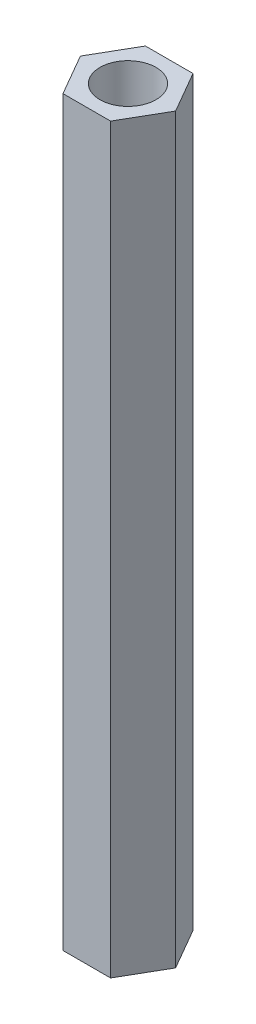
ISO-10303-21;
HEADER;
FILE_DESCRIPTION(('STEP AP214'),'2;1');
FILE_NAME('part.step','',(''),(''),'','','');
FILE_SCHEMA(('AUTOMOTIVE_DESIGN { 1 0 10303 214 1 1 1 1 }'));
ENDSEC;
DATA;
#1=APPLICATION_CONTEXT('core data for automotive mechanical design processes');
#2=APPLICATION_PROTOCOL_DEFINITION('international standard','automotive_design',2000,#1);
#3=PRODUCT_CONTEXT('',#1,'mechanical');
#4=PRODUCT('Part','Part','',(#3));
#5=PRODUCT_RELATED_PRODUCT_CATEGORY('part','',(#4));
#6=PRODUCT_DEFINITION_FORMATION('','',#4);
#7=PRODUCT_DEFINITION_CONTEXT('part definition',#1,'design');
#8=PRODUCT_DEFINITION('design','',#6,#7);
#9=PRODUCT_DEFINITION_SHAPE('','',#8);
#10=(LENGTH_UNIT() NAMED_UNIT(*) SI_UNIT(.MILLI.,.METRE.));
#11=(NAMED_UNIT(*) PLANE_ANGLE_UNIT() SI_UNIT($,.RADIAN.));
#12=(NAMED_UNIT(*) SI_UNIT($,.STERADIAN.) SOLID_ANGLE_UNIT());
#13=UNCERTAINTY_MEASURE_WITH_UNIT(LENGTH_MEASURE(1.E-05),#10,'distance_accuracy_value','');
#14=(GEOMETRIC_REPRESENTATION_CONTEXT(3) GLOBAL_UNCERTAINTY_ASSIGNED_CONTEXT((#13)) GLOBAL_UNIT_ASSIGNED_CONTEXT((#10,
#11,#12)) REPRESENTATION_CONTEXT('',''));
#15=CARTESIAN_POINT('',(0.,0.,0.));
#16=DIRECTION('',(0.,0.,1.));
#17=DIRECTION('',(1.,0.,0.));
#18=AXIS2_PLACEMENT_3D('',#15,#16,#17);
#19=CARTESIAN_POINT('',(0.,45.,0.));
#20=DIRECTION('',(0.,1.,0.));
#21=DIRECTION('',(0.,0.,1.));
#22=AXIS2_PLACEMENT_3D('',#19,#20,#21);
#23=PLANE('',#22);
#24=DIRECTION('',(0.5,0.,-0.866025403784439));
#25=VECTOR('',#24,1.);
#26=CARTESIAN_POINT('',(1.44337567297407,45.,2.5));
#27=LINE('',#26,#25);
#28=CARTESIAN_POINT('',(1.44337567297407,45.,2.5));
#29=VERTEX_POINT('',#28);
#30=CARTESIAN_POINT('',(2.88675134594813,45.,0.));
#31=VERTEX_POINT('',#30);
#32=EDGE_CURVE('E129',#29,#31,#27,.T.);
#33=ORIENTED_EDGE('',*,*,#32,.T.);
#34=DIRECTION('',(-0.5,0.,-0.866025403784438));
#35=VECTOR('',#34,1.);
#36=CARTESIAN_POINT('',(2.88675134594813,45.,0.));
#37=LINE('',#36,#35);
#38=CARTESIAN_POINT('',(1.44337567297406,45.,-2.5));
#39=VERTEX_POINT('',#38);
#40=EDGE_CURVE('E87',#31,#39,#37,.T.);
#41=ORIENTED_EDGE('',*,*,#40,.T.);
#42=DIRECTION('',(-1.,0.,0.));
#43=VECTOR('',#42,1.);
#44=CARTESIAN_POINT('',(1.44337567297406,45.,-2.5));
#45=LINE('',#44,#43);
#46=CARTESIAN_POINT('',(-1.44337567297406,45.,-2.5));
#47=VERTEX_POINT('',#46);
#48=EDGE_CURVE('E100',#39,#47,#45,.T.);
#49=ORIENTED_EDGE('',*,*,#48,.T.);
#50=DIRECTION('',(-0.5,0.,0.866025403784439));
#51=VECTOR('',#50,1.);
#52=CARTESIAN_POINT('',(-1.44337567297406,45.,-2.5));
#53=LINE('',#52,#51);
#54=CARTESIAN_POINT('',(-2.88675134594813,45.,0.));
#55=VERTEX_POINT('',#54);
#56=EDGE_CURVE('E94',#47,#55,#53,.T.);
#57=ORIENTED_EDGE('',*,*,#56,.T.);
#58=DIRECTION('',(0.5,0.,0.866025403784438));
#59=VECTOR('',#58,1.);
#60=CARTESIAN_POINT('',(-2.88675134594813,45.,0.));
#61=LINE('',#60,#59);
#62=CARTESIAN_POINT('',(-1.44337567297406,45.,2.5));
#63=VERTEX_POINT('',#62);
#64=EDGE_CURVE('E98',#55,#63,#61,.T.);
#65=ORIENTED_EDGE('',*,*,#64,.T.);
#66=DIRECTION('',(1.,0.,0.));
#67=VECTOR('',#66,1.);
#68=CARTESIAN_POINT('',(-1.44337567297406,45.,2.5));
#69=LINE('',#68,#67);
#70=EDGE_CURVE('E50',#63,#29,#69,.T.);
#71=ORIENTED_EDGE('',*,*,#70,.T.);
#72=EDGE_LOOP('',(#33,#41,#49,#57,#65,#71));
#73=FACE_BOUND('',#72,.T.);
#74=CARTESIAN_POINT('',(0.,45.,0.));
#75=DIRECTION('',(0.,1.,0.));
#76=DIRECTION('',(0.,0.,1.));
#77=AXIS2_PLACEMENT_3D('',#74,#75,#76);
#78=CIRCLE('',#77,1.7);
#79=CARTESIAN_POINT('',(0.,45.,-1.7));
#80=VERTEX_POINT('',#79);
#81=EDGE_CURVE('E122',#80,#80,#78,.T.);
#82=ORIENTED_EDGE('',*,*,#81,.F.);
#83=EDGE_LOOP('',(#82));
#84=FACE_BOUND('',#83,.T.);
#85=ADVANCED_FACE('F33',(#73,#84),#23,.T.);
#86=CARTESIAN_POINT('',(0.,0.,0.));
#87=DIRECTION('',(0.,1.,0.));
#88=DIRECTION('',(0.,0.,1.));
#89=AXIS2_PLACEMENT_3D('',#86,#87,#88);
#90=PLANE('',#89);
#91=DIRECTION('',(0.5,0.,-0.866025403784439));
#92=VECTOR('',#91,1.);
#93=CARTESIAN_POINT('',(1.44337567297407,0.,2.5));
#94=LINE('',#93,#92);
#95=CARTESIAN_POINT('',(1.44337567297407,0.,2.5));
#96=VERTEX_POINT('',#95);
#97=CARTESIAN_POINT('',(2.88675134594813,0.,0.));
#98=VERTEX_POINT('',#97);
#99=EDGE_CURVE('E118',#96,#98,#94,.T.);
#100=ORIENTED_EDGE('',*,*,#99,.F.);
#101=DIRECTION('',(1.,0.,0.));
#102=VECTOR('',#101,1.);
#103=CARTESIAN_POINT('',(-1.44337567297406,0.,2.5));
#104=LINE('',#103,#102);
#105=CARTESIAN_POINT('',(-1.44337567297406,0.,2.5));
#106=VERTEX_POINT('',#105);
#107=EDGE_CURVE('E79',#106,#96,#104,.T.);
#108=ORIENTED_EDGE('',*,*,#107,.F.);
#109=DIRECTION('',(0.5,0.,0.866025403784438));
#110=VECTOR('',#109,1.);
#111=CARTESIAN_POINT('',(-2.88675134594813,0.,0.));
#112=LINE('',#111,#110);
#113=CARTESIAN_POINT('',(-2.88675134594813,0.,0.));
#114=VERTEX_POINT('',#113);
#115=EDGE_CURVE('E73',#114,#106,#112,.T.);
#116=ORIENTED_EDGE('',*,*,#115,.F.);
#117=DIRECTION('',(-0.5,0.,0.866025403784439));
#118=VECTOR('',#117,1.);
#119=CARTESIAN_POINT('',(-1.44337567297406,0.,-2.5));
#120=LINE('',#119,#118);
#121=CARTESIAN_POINT('',(-1.44337567297406,0.,-2.5));
#122=VERTEX_POINT('',#121);
#123=EDGE_CURVE('E108',#122,#114,#120,.T.);
#124=ORIENTED_EDGE('',*,*,#123,.F.);
#125=DIRECTION('',(-1.,0.,0.));
#126=VECTOR('',#125,1.);
#127=CARTESIAN_POINT('',(1.44337567297406,0.,-2.5));
#128=LINE('',#127,#126);
#129=CARTESIAN_POINT('',(1.44337567297406,0.,-2.5));
#130=VERTEX_POINT('',#129);
#131=EDGE_CURVE('E124',#130,#122,#128,.T.);
#132=ORIENTED_EDGE('',*,*,#131,.F.);
#133=DIRECTION('',(-0.5,0.,-0.866025403784438));
#134=VECTOR('',#133,1.);
#135=CARTESIAN_POINT('',(2.88675134594813,0.,0.));
#136=LINE('',#135,#134);
#137=EDGE_CURVE('E121',#98,#130,#136,.T.);
#138=ORIENTED_EDGE('',*,*,#137,.F.);
#139=EDGE_LOOP('',(#100,#108,#116,#124,#132,#138));
#140=FACE_BOUND('',#139,.T.);
#141=CARTESIAN_POINT('',(0.,0.,0.));
#142=DIRECTION('',(0.,1.,0.));
#143=DIRECTION('',(0.,0.,1.));
#144=AXIS2_PLACEMENT_3D('',#141,#142,#143);
#145=CIRCLE('',#144,1.7);
#146=CARTESIAN_POINT('',(0.,0.,-1.7));
#147=VERTEX_POINT('',#146);
#148=EDGE_CURVE('E222',#147,#147,#145,.T.);
#149=ORIENTED_EDGE('',*,*,#148,.T.);
#150=EDGE_LOOP('',(#149));
#151=FACE_BOUND('',#150,.T.);
#152=ADVANCED_FACE('F138',(#140,#151),#90,.F.);
#153=CARTESIAN_POINT('',(1.44337567297407,45.,2.5));
#154=DIRECTION('',(-0.866025403784439,0.,-0.5));
#155=DIRECTION('',(-0.5,0.,0.866025403784439));
#156=AXIS2_PLACEMENT_3D('',#153,#154,#155);
#157=PLANE('',#156);
#158=ORIENTED_EDGE('',*,*,#99,.T.);
#159=DIRECTION('',(0.,-1.,0.));
#160=VECTOR('',#159,1.);
#161=CARTESIAN_POINT('',(2.88675134594813,45.,0.));
#162=LINE('',#161,#160);
#163=EDGE_CURVE('E11',#31,#98,#162,.T.);
#164=ORIENTED_EDGE('',*,*,#163,.F.);
#165=ORIENTED_EDGE('',*,*,#32,.F.);
#166=DIRECTION('',(0.,-1.,0.));
#167=VECTOR('',#166,1.);
#168=CARTESIAN_POINT('',(1.44337567297407,45.,2.5));
#169=LINE('',#168,#167);
#170=EDGE_CURVE('E114',#29,#96,#169,.T.);
#171=ORIENTED_EDGE('',*,*,#170,.T.);
#172=EDGE_LOOP('',(#158,#164,#165,#171));
#173=FACE_BOUND('',#172,.T.);
#174=ADVANCED_FACE('F35',(#173),#157,.F.);
#175=CARTESIAN_POINT('',(2.88675134594813,45.,0.));
#176=DIRECTION('',(-0.866025403784438,0.,0.5));
#177=DIRECTION('',(0.5,0.,0.866025403784439));
#178=AXIS2_PLACEMENT_3D('',#175,#176,#177);
#179=PLANE('',#178);
#180=ORIENTED_EDGE('',*,*,#137,.T.);
#181=DIRECTION('',(0.,-1.,0.));
#182=VECTOR('',#181,1.);
#183=CARTESIAN_POINT('',(1.44337567297406,45.,-2.5));
#184=LINE('',#183,#182);
#185=EDGE_CURVE('E42',#39,#130,#184,.T.);
#186=ORIENTED_EDGE('',*,*,#185,.F.);
#187=ORIENTED_EDGE('',*,*,#40,.F.);
#188=ORIENTED_EDGE('',*,*,#163,.T.);
#189=EDGE_LOOP('',(#180,#186,#187,#188));
#190=FACE_BOUND('',#189,.T.);
#191=ADVANCED_FACE('F163',(#190),#179,.F.);
#192=CARTESIAN_POINT('',(1.44337567297406,45.,-2.5));
#193=DIRECTION('',(0.,0.,1.));
#194=DIRECTION('',(1.,0.,0.));
#195=AXIS2_PLACEMENT_3D('',#192,#193,#194);
#196=PLANE('',#195);
#197=ORIENTED_EDGE('',*,*,#131,.T.);
#198=DIRECTION('',(0.,-1.,0.));
#199=VECTOR('',#198,1.);
#200=CARTESIAN_POINT('',(-1.44337567297406,45.,-2.5));
#201=LINE('',#200,#199);
#202=EDGE_CURVE('E109',#47,#122,#201,.T.);
#203=ORIENTED_EDGE('',*,*,#202,.F.);
#204=ORIENTED_EDGE('',*,*,#48,.F.);
#205=ORIENTED_EDGE('',*,*,#185,.T.);
#206=EDGE_LOOP('',(#197,#203,#204,#205));
#207=FACE_BOUND('',#206,.T.);
#208=ADVANCED_FACE('F135',(#207),#196,.F.);
#209=CARTESIAN_POINT('',(-1.44337567297406,45.,-2.5));
#210=DIRECTION('',(0.866025403784439,0.,0.5));
#211=DIRECTION('',(0.5,0.,-0.866025403784439));
#212=AXIS2_PLACEMENT_3D('',#209,#210,#211);
#213=PLANE('',#212);
#214=ORIENTED_EDGE('',*,*,#123,.T.);
#215=DIRECTION('',(0.,-1.,0.));
#216=VECTOR('',#215,1.);
#217=CARTESIAN_POINT('',(-2.88675134594813,45.,0.));
#218=LINE('',#217,#216);
#219=EDGE_CURVE('E105',#55,#114,#218,.T.);
#220=ORIENTED_EDGE('',*,*,#219,.F.);
#221=ORIENTED_EDGE('',*,*,#56,.F.);
#222=ORIENTED_EDGE('',*,*,#202,.T.);
#223=EDGE_LOOP('',(#214,#220,#221,#222));
#224=FACE_BOUND('',#223,.T.);
#225=ADVANCED_FACE('F106',(#224),#213,.F.);
#226=CARTESIAN_POINT('',(-2.88675134594813,45.,0.));
#227=DIRECTION('',(0.866025403784438,0.,-0.5));
#228=DIRECTION('',(-0.5,0.,-0.866025403784439));
#229=AXIS2_PLACEMENT_3D('',#226,#227,#228);
#230=PLANE('',#229);
#231=ORIENTED_EDGE('',*,*,#115,.T.);
#232=DIRECTION('',(0.,-1.,0.));
#233=VECTOR('',#232,1.);
#234=CARTESIAN_POINT('',(-1.44337567297406,45.,2.5));
#235=LINE('',#234,#233);
#236=EDGE_CURVE('E110',#63,#106,#235,.T.);
#237=ORIENTED_EDGE('',*,*,#236,.F.);
#238=ORIENTED_EDGE('',*,*,#64,.F.);
#239=ORIENTED_EDGE('',*,*,#219,.T.);
#240=EDGE_LOOP('',(#231,#237,#238,#239));
#241=FACE_BOUND('',#240,.T.);
#242=ADVANCED_FACE('F112',(#241),#230,.F.);
#243=CARTESIAN_POINT('',(-1.44337567297406,45.,2.5));
#244=DIRECTION('',(0.,0.,-1.));
#245=DIRECTION('',(-1.,0.,0.));
#246=AXIS2_PLACEMENT_3D('',#243,#244,#245);
#247=PLANE('',#246);
#248=ORIENTED_EDGE('',*,*,#107,.T.);
#249=ORIENTED_EDGE('',*,*,#170,.F.);
#250=ORIENTED_EDGE('',*,*,#70,.F.);
#251=ORIENTED_EDGE('',*,*,#236,.T.);
#252=EDGE_LOOP('',(#248,#249,#250,#251));
#253=FACE_BOUND('',#252,.T.);
#254=ADVANCED_FACE('F143',(#253),#247,.F.);
#255=CARTESIAN_POINT('',(0.,45.,0.));
#256=DIRECTION('',(0.,-1.,0.));
#257=DIRECTION('',(0.,0.,-1.));
#258=AXIS2_PLACEMENT_3D('',#255,#256,#257);
#259=CYLINDRICAL_SURFACE('',#258,1.7);
#260=CARTESIAN_POINT('',(0.,45.,-1.7));
#261=CARTESIAN_POINT('',(0.,44.53125,-1.7));
#262=CARTESIAN_POINT('',(0.,44.0625,-1.7));
#263=CARTESIAN_POINT('',(0.,43.125,-1.7));
#264=CARTESIAN_POINT('',(0.,42.65625,-1.7));
#265=CARTESIAN_POINT('',(0.,41.71875,-1.7));
#266=CARTESIAN_POINT('',(0.,41.25,-1.7));
#267=CARTESIAN_POINT('',(0.,40.3125,-1.7));
#268=CARTESIAN_POINT('',(0.,39.84375,-1.7));
#269=CARTESIAN_POINT('',(0.,38.90625,-1.7));
#270=CARTESIAN_POINT('',(0.,38.4375,-1.7));
#271=CARTESIAN_POINT('',(0.,37.5,-1.7));
#272=CARTESIAN_POINT('',(0.,37.03125,-1.7));
#273=CARTESIAN_POINT('',(0.,36.09375,-1.7));
#274=CARTESIAN_POINT('',(0.,35.625,-1.7));
#275=CARTESIAN_POINT('',(0.,34.6875,-1.7));
#276=CARTESIAN_POINT('',(0.,34.21875,-1.7));
#277=CARTESIAN_POINT('',(0.,33.28125,-1.7));
#278=CARTESIAN_POINT('',(0.,32.8125,-1.7));
#279=CARTESIAN_POINT('',(0.,31.875,-1.7));
#280=CARTESIAN_POINT('',(0.,31.40625,-1.7));
#281=CARTESIAN_POINT('',(0.,30.46875,-1.7));
#282=CARTESIAN_POINT('',(0.,30.,-1.7));
#283=CARTESIAN_POINT('',(0.,29.0625,-1.7));
#284=CARTESIAN_POINT('',(0.,28.59375,-1.7));
#285=CARTESIAN_POINT('',(0.,27.65625,-1.7));
#286=CARTESIAN_POINT('',(0.,27.1875,-1.7));
#287=CARTESIAN_POINT('',(0.,26.25,-1.7));
#288=CARTESIAN_POINT('',(0.,25.78125,-1.7));
#289=CARTESIAN_POINT('',(0.,24.84375,-1.7));
#290=CARTESIAN_POINT('',(0.,24.375,-1.7));
#291=CARTESIAN_POINT('',(0.,23.4375,-1.7));
#292=CARTESIAN_POINT('',(0.,22.96875,-1.7));
#293=CARTESIAN_POINT('',(0.,22.03125,-1.7));
#294=CARTESIAN_POINT('',(0.,21.5625,-1.7));
#295=CARTESIAN_POINT('',(0.,20.625,-1.7));
#296=CARTESIAN_POINT('',(0.,20.15625,-1.7));
#297=CARTESIAN_POINT('',(0.,19.21875,-1.7));
#298=CARTESIAN_POINT('',(0.,18.75,-1.7));
#299=CARTESIAN_POINT('',(0.,17.8125,-1.7));
#300=CARTESIAN_POINT('',(0.,17.34375,-1.7));
#301=CARTESIAN_POINT('',(0.,16.40625,-1.7));
#302=CARTESIAN_POINT('',(0.,15.9375,-1.7));
#303=CARTESIAN_POINT('',(0.,15.,-1.7));
#304=CARTESIAN_POINT('',(0.,14.53125,-1.7));
#305=CARTESIAN_POINT('',(0.,13.59375,-1.7));
#306=CARTESIAN_POINT('',(0.,13.125,-1.7));
#307=CARTESIAN_POINT('',(0.,12.1875,-1.7));
#308=CARTESIAN_POINT('',(0.,11.71875,-1.7));
#309=CARTESIAN_POINT('',(0.,10.78125,-1.7));
#310=CARTESIAN_POINT('',(0.,10.3125,-1.7));
#311=CARTESIAN_POINT('',(0.,9.375,-1.7));
#312=CARTESIAN_POINT('',(0.,8.90625,-1.7));
#313=CARTESIAN_POINT('',(0.,7.96874999999999,-1.7));
#314=CARTESIAN_POINT('',(0.,7.5,-1.7));
#315=CARTESIAN_POINT('',(0.,6.5625,-1.7));
#316=CARTESIAN_POINT('',(0.,6.09375,-1.7));
#317=CARTESIAN_POINT('',(0.,5.15625,-1.7));
#318=CARTESIAN_POINT('',(0.,4.68749999999999,-1.7));
#319=CARTESIAN_POINT('',(0.,3.74999999999999,-1.7));
#320=CARTESIAN_POINT('',(0.,3.28124999999999,-1.7));
#321=CARTESIAN_POINT('',(0.,2.34374999999999,-1.7));
#322=CARTESIAN_POINT('',(0.,1.87499999999999,-1.7));
#323=CARTESIAN_POINT('',(0.,0.937499999999992,-1.7));
#324=CARTESIAN_POINT('',(0.,0.468749999999993,-1.7));
#325=CARTESIAN_POINT('',(0.,0.,-1.7));
#326=B_SPLINE_CURVE_WITH_KNOTS('',3,(#260,#261,#262,#263,#264,#265,#266,#267,#268,#269,#270,
#271,#272,#273,#274,#275,#276,#277,#278,#279,#280,#281,#282,#283,#284,#285,#286,#287,#288,#289,
#290,#291,#292,#293,#294,#295,#296,#297,#298,#299,#300,#301,#302,#303,#304,#305,#306,#307,#308,
#309,#310,#311,#312,#313,#314,#315,#316,#317,#318,#319,#320,#321,#322,#323,#324,#325),
.UNSPECIFIED.,.F.,.F.,(4,2,2,2,2,2,2,2,2,2,2,2,2,2,2,2,2,2,2,2,2,2,2,2,2,2,2,2,2,2,2,2,4),(0.,
1.40625,2.8125,4.21875000000001,5.62500000000001,7.03125,8.4375,9.84375000000001,11.25,12.65625,
14.0625,15.46875,16.875,18.28125,19.6875,21.09375,22.5,23.90625,25.3125,26.71875,28.125,
29.53125,30.9375,32.34375,33.75,35.15625,36.5625,37.96875,39.375,40.78125,42.1875,43.59375,45.),.UNSPECIFIED.);
#327=EDGE_CURVE('BSEAM145',#80,#147,#326,.T.);
#328=ORIENTED_EDGE('',*,*,#81,.T.);
#329=ORIENTED_EDGE('',*,*,#148,.F.);
#330=ORIENTED_EDGE('',*,*,#327,.T.);
#331=ORIENTED_EDGE('',*,*,#327,.F.);
#332=EDGE_LOOP('',(#328,#330,#329,#331));
#333=FACE_BOUND('',#332,.T.);
#334=ADVANCED_FACE('F145',(#333),#259,.F.);
#335=CLOSED_SHELL('',(#85,#152,#174,#191,#208,#225,#242,#254,#334));
#336=MANIFOLD_SOLID_BREP('B2',#335);
#337=ADVANCED_BREP_SHAPE_REPRESENTATION('',(#18,#336),#14);
#338=SHAPE_DEFINITION_REPRESENTATION(#9,#337);
ENDSEC;
END-ISO-10303-21;
